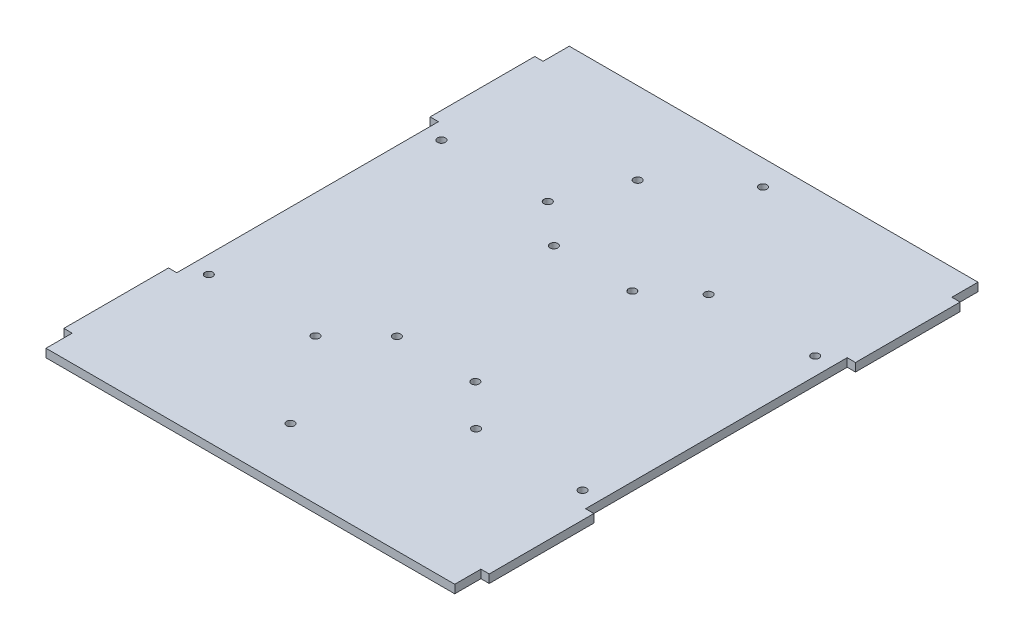
ISO-10303-21;
HEADER;
FILE_DESCRIPTION(('STEP AP214'),'2;1');
FILE_NAME('part.step','',(''),(''),'','','');
FILE_SCHEMA(('AUTOMOTIVE_DESIGN { 1 0 10303 214 1 1 1 1 }'));
ENDSEC;
DATA;
#1=APPLICATION_CONTEXT('core data for automotive mechanical design processes');
#2=APPLICATION_PROTOCOL_DEFINITION('international standard','automotive_design',2000,#1);
#3=PRODUCT_CONTEXT('',#1,'mechanical');
#4=PRODUCT('Part','Part','',(#3));
#5=PRODUCT_RELATED_PRODUCT_CATEGORY('part','',(#4));
#6=PRODUCT_DEFINITION_FORMATION('','',#4);
#7=PRODUCT_DEFINITION_CONTEXT('part definition',#1,'design');
#8=PRODUCT_DEFINITION('design','',#6,#7);
#9=PRODUCT_DEFINITION_SHAPE('','',#8);
#10=(LENGTH_UNIT() NAMED_UNIT(*) SI_UNIT(.MILLI.,.METRE.));
#11=(NAMED_UNIT(*) PLANE_ANGLE_UNIT() SI_UNIT($,.RADIAN.));
#12=(NAMED_UNIT(*) SI_UNIT($,.STERADIAN.) SOLID_ANGLE_UNIT());
#13=UNCERTAINTY_MEASURE_WITH_UNIT(LENGTH_MEASURE(1.E-05),#10,'distance_accuracy_value','');
#14=(GEOMETRIC_REPRESENTATION_CONTEXT(3) GLOBAL_UNCERTAINTY_ASSIGNED_CONTEXT((#13)) GLOBAL_UNIT_ASSIGNED_CONTEXT((#10,
#11,#12)) REPRESENTATION_CONTEXT('',''));
#15=CARTESIAN_POINT('',(0.,0.,0.));
#16=DIRECTION('',(0.,0.,1.));
#17=DIRECTION('',(1.,0.,0.));
#18=AXIS2_PLACEMENT_3D('',#15,#16,#17);
#19=CARTESIAN_POINT('',(0.,3.175,-10.));
#20=DIRECTION('',(1.,0.,0.));
#21=DIRECTION('',(0.,0.,-1.));
#22=AXIS2_PLACEMENT_3D('',#19,#20,#21);
#23=PLANE('',#22);
#24=DIRECTION('',(0.,0.,1.));
#25=VECTOR('',#24,1.);
#26=CARTESIAN_POINT('',(0.,0.,-10.));
#27=LINE('',#26,#25);
#28=CARTESIAN_POINT('',(0.,0.,-10.));
#29=VERTEX_POINT('',#28);
#30=CARTESIAN_POINT('',(0.,0.,0.));
#31=VERTEX_POINT('',#30);
#32=EDGE_CURVE('E201',#29,#31,#27,.T.);
#33=ORIENTED_EDGE('',*,*,#32,.T.);
#34=DIRECTION('',(0.,-1.,0.));
#35=VECTOR('',#34,1.);
#36=CARTESIAN_POINT('',(0.,3.175,0.));
#37=LINE('',#36,#35);
#38=CARTESIAN_POINT('',(0.,3.175,0.));
#39=VERTEX_POINT('',#38);
#40=EDGE_CURVE('E11',#39,#31,#37,.T.);
#41=ORIENTED_EDGE('',*,*,#40,.F.);
#42=DIRECTION('',(0.,0.,1.));
#43=VECTOR('',#42,1.);
#44=CARTESIAN_POINT('',(0.,3.175,-10.));
#45=LINE('',#44,#43);
#46=CARTESIAN_POINT('',(0.,3.175,-10.));
#47=VERTEX_POINT('',#46);
#48=EDGE_CURVE('E240',#47,#39,#45,.T.);
#49=ORIENTED_EDGE('',*,*,#48,.F.);
#50=DIRECTION('',(0.,-1.,0.));
#51=VECTOR('',#50,1.);
#52=CARTESIAN_POINT('',(0.,3.175,-10.));
#53=LINE('',#52,#51);
#54=EDGE_CURVE('E197',#47,#29,#53,.T.);
#55=ORIENTED_EDGE('',*,*,#54,.T.);
#56=EDGE_LOOP('',(#33,#41,#49,#55));
#57=FACE_BOUND('',#56,.T.);
#58=ADVANCED_FACE('F33',(#57),#23,.F.);
#59=CARTESIAN_POINT('',(0.,3.175,0.));
#60=DIRECTION('',(0.,0.,-1.));
#61=DIRECTION('',(-1.,0.,0.));
#62=AXIS2_PLACEMENT_3D('',#59,#60,#61);
#63=PLANE('',#62);
#64=DIRECTION('',(1.,0.,0.));
#65=VECTOR('',#64,1.);
#66=CARTESIAN_POINT('',(0.,0.,0.));
#67=LINE('',#66,#65);
#68=CARTESIAN_POINT('',(156.24,0.,0.));
#69=VERTEX_POINT('',#68);
#70=EDGE_CURVE('E204',#31,#69,#67,.T.);
#71=ORIENTED_EDGE('',*,*,#70,.T.);
#72=DIRECTION('',(0.,-1.,0.));
#73=VECTOR('',#72,1.);
#74=CARTESIAN_POINT('',(156.24,3.175,0.));
#75=LINE('',#74,#73);
#76=CARTESIAN_POINT('',(156.24,3.175,0.));
#77=VERTEX_POINT('',#76);
#78=EDGE_CURVE('E41',#77,#69,#75,.T.);
#79=ORIENTED_EDGE('',*,*,#78,.F.);
#80=DIRECTION('',(1.,0.,0.));
#81=VECTOR('',#80,1.);
#82=CARTESIAN_POINT('',(0.,3.175,0.));
#83=LINE('',#82,#81);
#84=EDGE_CURVE('E128',#39,#77,#83,.T.);
#85=ORIENTED_EDGE('',*,*,#84,.F.);
#86=ORIENTED_EDGE('',*,*,#40,.T.);
#87=EDGE_LOOP('',(#71,#79,#85,#86));
#88=FACE_BOUND('',#87,.T.);
#89=ADVANCED_FACE('F359',(#88),#63,.F.);
#90=CARTESIAN_POINT('',(156.24,3.175,-10.));
#91=DIRECTION('',(-1.,0.,0.));
#92=DIRECTION('',(0.,0.,1.));
#93=AXIS2_PLACEMENT_3D('',#90,#91,#92);
#94=PLANE('',#93);
#95=DIRECTION('',(0.,0.,-1.));
#96=VECTOR('',#95,1.);
#97=CARTESIAN_POINT('',(156.24,0.,-10.));
#98=LINE('',#97,#96);
#99=CARTESIAN_POINT('',(156.24,0.,-10.));
#100=VERTEX_POINT('',#99);
#101=EDGE_CURVE('E207',#69,#100,#98,.T.);
#102=ORIENTED_EDGE('',*,*,#101,.T.);
#103=DIRECTION('',(0.,-1.,0.));
#104=VECTOR('',#103,1.);
#105=CARTESIAN_POINT('',(156.24,3.175,-10.));
#106=LINE('',#105,#104);
#107=CARTESIAN_POINT('',(156.24,3.175,-10.));
#108=VERTEX_POINT('',#107);
#109=EDGE_CURVE('E283',#108,#100,#106,.T.);
#110=ORIENTED_EDGE('',*,*,#109,.F.);
#111=DIRECTION('',(0.,0.,-1.));
#112=VECTOR('',#111,1.);
#113=CARTESIAN_POINT('',(156.24,3.175,-10.));
#114=LINE('',#113,#112);
#115=EDGE_CURVE('E291',#77,#108,#114,.T.);
#116=ORIENTED_EDGE('',*,*,#115,.F.);
#117=ORIENTED_EDGE('',*,*,#78,.T.);
#118=EDGE_LOOP('',(#102,#110,#116,#117));
#119=FACE_BOUND('',#118,.T.);
#120=ADVANCED_FACE('F289',(#119),#94,.F.);
#121=CARTESIAN_POINT('',(156.24,3.175,-10.));
#122=DIRECTION('',(0.,0.,-1.));
#123=DIRECTION('',(-1.,0.,0.));
#124=AXIS2_PLACEMENT_3D('',#121,#122,#123);
#125=PLANE('',#124);
#126=DIRECTION('',(1.,0.,0.));
#127=VECTOR('',#126,1.);
#128=CARTESIAN_POINT('',(156.24,0.,-10.));
#129=LINE('',#128,#127);
#130=CARTESIAN_POINT('',(159.415,0.,-10.));
#131=VERTEX_POINT('',#130);
#132=EDGE_CURVE('E209',#100,#131,#129,.T.);
#133=ORIENTED_EDGE('',*,*,#132,.T.);
#134=DIRECTION('',(0.,-1.,0.));
#135=VECTOR('',#134,1.);
#136=CARTESIAN_POINT('',(159.415,3.175,-10.));
#137=LINE('',#136,#135);
#138=CARTESIAN_POINT('',(159.415,3.175,-10.));
#139=VERTEX_POINT('',#138);
#140=EDGE_CURVE('E280',#139,#131,#137,.T.);
#141=ORIENTED_EDGE('',*,*,#140,.F.);
#142=DIRECTION('',(1.,0.,0.));
#143=VECTOR('',#142,1.);
#144=CARTESIAN_POINT('',(156.24,3.175,-10.));
#145=LINE('',#144,#143);
#146=EDGE_CURVE('E309',#108,#139,#145,.T.);
#147=ORIENTED_EDGE('',*,*,#146,.F.);
#148=ORIENTED_EDGE('',*,*,#109,.T.);
#149=EDGE_LOOP('',(#133,#141,#147,#148));
#150=FACE_BOUND('',#149,.T.);
#151=ADVANCED_FACE('F300',(#150),#125,.F.);
#152=CARTESIAN_POINT('',(159.415,3.175,-10.));
#153=DIRECTION('',(-1.,0.,0.));
#154=DIRECTION('',(0.,0.,1.));
#155=AXIS2_PLACEMENT_3D('',#152,#153,#154);
#156=PLANE('',#155);
#157=DIRECTION('',(0.,0.,-1.));
#158=VECTOR('',#157,1.);
#159=CARTESIAN_POINT('',(159.415,0.,-10.));
#160=LINE('',#159,#158);
#161=CARTESIAN_POINT('',(159.415,0.,-50.));
#162=VERTEX_POINT('',#161);
#163=EDGE_CURVE('E211',#131,#162,#160,.T.);
#164=ORIENTED_EDGE('',*,*,#163,.T.);
#165=DIRECTION('',(0.,-1.,0.));
#166=VECTOR('',#165,1.);
#167=CARTESIAN_POINT('',(159.415,3.175,-50.));
#168=LINE('',#167,#166);
#169=CARTESIAN_POINT('',(159.415,3.175,-50.));
#170=VERTEX_POINT('',#169);
#171=EDGE_CURVE('E277',#170,#162,#168,.T.);
#172=ORIENTED_EDGE('',*,*,#171,.F.);
#173=DIRECTION('',(0.,0.,-1.));
#174=VECTOR('',#173,1.);
#175=CARTESIAN_POINT('',(159.415,3.175,-10.));
#176=LINE('',#175,#174);
#177=EDGE_CURVE('E306',#139,#170,#176,.T.);
#178=ORIENTED_EDGE('',*,*,#177,.F.);
#179=ORIENTED_EDGE('',*,*,#140,.T.);
#180=EDGE_LOOP('',(#164,#172,#178,#179));
#181=FACE_BOUND('',#180,.T.);
#182=ADVANCED_FACE('F304',(#181),#156,.F.);
#183=CARTESIAN_POINT('',(159.415,3.175,-50.));
#184=DIRECTION('',(0.,0.,1.));
#185=DIRECTION('',(1.,0.,0.));
#186=AXIS2_PLACEMENT_3D('',#183,#184,#185);
#187=PLANE('',#186);
#188=DIRECTION('',(-1.,0.,0.));
#189=VECTOR('',#188,1.);
#190=CARTESIAN_POINT('',(159.415,0.,-50.));
#191=LINE('',#190,#189);
#192=CARTESIAN_POINT('',(156.24,0.,-50.));
#193=VERTEX_POINT('',#192);
#194=EDGE_CURVE('E213',#162,#193,#191,.T.);
#195=ORIENTED_EDGE('',*,*,#194,.T.);
#196=DIRECTION('',(0.,-1.,0.));
#197=VECTOR('',#196,1.);
#198=CARTESIAN_POINT('',(156.24,3.175,-50.));
#199=LINE('',#198,#197);
#200=CARTESIAN_POINT('',(156.24,3.175,-50.));
#201=VERTEX_POINT('',#200);
#202=EDGE_CURVE('E274',#201,#193,#199,.T.);
#203=ORIENTED_EDGE('',*,*,#202,.F.);
#204=DIRECTION('',(-1.,0.,0.));
#205=VECTOR('',#204,1.);
#206=CARTESIAN_POINT('',(159.415,3.175,-50.));
#207=LINE('',#206,#205);
#208=EDGE_CURVE('E308',#170,#201,#207,.T.);
#209=ORIENTED_EDGE('',*,*,#208,.F.);
#210=ORIENTED_EDGE('',*,*,#171,.T.);
#211=EDGE_LOOP('',(#195,#203,#209,#210));
#212=FACE_BOUND('',#211,.T.);
#213=ADVANCED_FACE('F372',(#212),#187,.F.);
#214=CARTESIAN_POINT('',(156.24,3.175,-150.));
#215=DIRECTION('',(-1.,0.,0.));
#216=DIRECTION('',(0.,0.,1.));
#217=AXIS2_PLACEMENT_3D('',#214,#215,#216);
#218=PLANE('',#217);
#219=DIRECTION('',(0.,0.,-1.));
#220=VECTOR('',#219,1.);
#221=CARTESIAN_POINT('',(156.24,0.,-150.));
#222=LINE('',#221,#220);
#223=CARTESIAN_POINT('',(156.24,0.,-150.));
#224=VERTEX_POINT('',#223);
#225=EDGE_CURVE('E215',#193,#224,#222,.T.);
#226=ORIENTED_EDGE('',*,*,#225,.T.);
#227=DIRECTION('',(0.,-1.,0.));
#228=VECTOR('',#227,1.);
#229=CARTESIAN_POINT('',(156.24,3.175,-150.));
#230=LINE('',#229,#228);
#231=CARTESIAN_POINT('',(156.24,3.175,-150.));
#232=VERTEX_POINT('',#231);
#233=EDGE_CURVE('E271',#232,#224,#230,.T.);
#234=ORIENTED_EDGE('',*,*,#233,.F.);
#235=DIRECTION('',(0.,0.,-1.));
#236=VECTOR('',#235,1.);
#237=CARTESIAN_POINT('',(156.24,3.175,-150.));
#238=LINE('',#237,#236);
#239=EDGE_CURVE('E311',#201,#232,#238,.T.);
#240=ORIENTED_EDGE('',*,*,#239,.F.);
#241=ORIENTED_EDGE('',*,*,#202,.T.);
#242=EDGE_LOOP('',(#226,#234,#240,#241));
#243=FACE_BOUND('',#242,.T.);
#244=ADVANCED_FACE('F375',(#243),#218,.F.);
#245=CARTESIAN_POINT('',(159.415,3.175,-150.));
#246=DIRECTION('',(0.,0.,-1.));
#247=DIRECTION('',(-1.,0.,0.));
#248=AXIS2_PLACEMENT_3D('',#245,#246,#247);
#249=PLANE('',#248);
#250=DIRECTION('',(1.,0.,0.));
#251=VECTOR('',#250,1.);
#252=CARTESIAN_POINT('',(159.415,0.,-150.));
#253=LINE('',#252,#251);
#254=CARTESIAN_POINT('',(159.415,0.,-150.));
#255=VERTEX_POINT('',#254);
#256=EDGE_CURVE('E217',#224,#255,#253,.T.);
#257=ORIENTED_EDGE('',*,*,#256,.T.);
#258=DIRECTION('',(0.,-1.,0.));
#259=VECTOR('',#258,1.);
#260=CARTESIAN_POINT('',(159.415,3.175,-150.));
#261=LINE('',#260,#259);
#262=CARTESIAN_POINT('',(159.415,3.175,-150.));
#263=VERTEX_POINT('',#262);
#264=EDGE_CURVE('E268',#263,#255,#261,.T.);
#265=ORIENTED_EDGE('',*,*,#264,.F.);
#266=DIRECTION('',(1.,0.,0.));
#267=VECTOR('',#266,1.);
#268=CARTESIAN_POINT('',(159.415,3.175,-150.));
#269=LINE('',#268,#267);
#270=EDGE_CURVE('E317',#232,#263,#269,.T.);
#271=ORIENTED_EDGE('',*,*,#270,.F.);
#272=ORIENTED_EDGE('',*,*,#233,.T.);
#273=EDGE_LOOP('',(#257,#265,#271,#272));
#274=FACE_BOUND('',#273,.T.);
#275=ADVANCED_FACE('F379',(#274),#249,.F.);
#276=CARTESIAN_POINT('',(159.415,3.175,-190.));
#277=DIRECTION('',(-1.,0.,0.));
#278=DIRECTION('',(0.,0.,1.));
#279=AXIS2_PLACEMENT_3D('',#276,#277,#278);
#280=PLANE('',#279);
#281=DIRECTION('',(0.,0.,-1.));
#282=VECTOR('',#281,1.);
#283=CARTESIAN_POINT('',(159.415,0.,-190.));
#284=LINE('',#283,#282);
#285=CARTESIAN_POINT('',(159.415,0.,-190.));
#286=VERTEX_POINT('',#285);
#287=EDGE_CURVE('E219',#255,#286,#284,.T.);
#288=ORIENTED_EDGE('',*,*,#287,.T.);
#289=DIRECTION('',(0.,-1.,0.));
#290=VECTOR('',#289,1.);
#291=CARTESIAN_POINT('',(159.415,3.175,-190.));
#292=LINE('',#291,#290);
#293=CARTESIAN_POINT('',(159.415,3.175,-190.));
#294=VERTEX_POINT('',#293);
#295=EDGE_CURVE('E265',#294,#286,#292,.T.);
#296=ORIENTED_EDGE('',*,*,#295,.F.);
#297=DIRECTION('',(0.,0.,-1.));
#298=VECTOR('',#297,1.);
#299=CARTESIAN_POINT('',(159.415,3.175,-190.));
#300=LINE('',#299,#298);
#301=EDGE_CURVE('E319',#263,#294,#300,.T.);
#302=ORIENTED_EDGE('',*,*,#301,.F.);
#303=ORIENTED_EDGE('',*,*,#264,.T.);
#304=EDGE_LOOP('',(#288,#296,#302,#303));
#305=FACE_BOUND('',#304,.T.);
#306=ADVANCED_FACE('F383',(#305),#280,.F.);
#307=CARTESIAN_POINT('',(156.24,3.175,-190.));
#308=DIRECTION('',(0.,0.,1.));
#309=DIRECTION('',(1.,0.,0.));
#310=AXIS2_PLACEMENT_3D('',#307,#308,#309);
#311=PLANE('',#310);
#312=DIRECTION('',(-1.,0.,0.));
#313=VECTOR('',#312,1.);
#314=CARTESIAN_POINT('',(156.24,0.,-190.));
#315=LINE('',#314,#313);
#316=CARTESIAN_POINT('',(156.24,0.,-190.));
#317=VERTEX_POINT('',#316);
#318=EDGE_CURVE('E221',#286,#317,#315,.T.);
#319=ORIENTED_EDGE('',*,*,#318,.T.);
#320=DIRECTION('',(0.,-1.,0.));
#321=VECTOR('',#320,1.);
#322=CARTESIAN_POINT('',(156.24,3.175,-190.));
#323=LINE('',#322,#321);
#324=CARTESIAN_POINT('',(156.24,3.175,-190.));
#325=VERTEX_POINT('',#324);
#326=EDGE_CURVE('E262',#325,#317,#323,.T.);
#327=ORIENTED_EDGE('',*,*,#326,.F.);
#328=DIRECTION('',(-1.,0.,0.));
#329=VECTOR('',#328,1.);
#330=CARTESIAN_POINT('',(156.24,3.175,-190.));
#331=LINE('',#330,#329);
#332=EDGE_CURVE('E321',#294,#325,#331,.T.);
#333=ORIENTED_EDGE('',*,*,#332,.F.);
#334=ORIENTED_EDGE('',*,*,#295,.T.);
#335=EDGE_LOOP('',(#319,#327,#333,#334));
#336=FACE_BOUND('',#335,.T.);
#337=ADVANCED_FACE('F387',(#336),#311,.F.);
#338=CARTESIAN_POINT('',(156.24,3.175,-200.));
#339=DIRECTION('',(-1.,0.,0.));
#340=DIRECTION('',(0.,0.,1.));
#341=AXIS2_PLACEMENT_3D('',#338,#339,#340);
#342=PLANE('',#341);
#343=DIRECTION('',(0.,0.,-1.));
#344=VECTOR('',#343,1.);
#345=CARTESIAN_POINT('',(156.24,0.,-200.));
#346=LINE('',#345,#344);
#347=CARTESIAN_POINT('',(156.24,0.,-200.));
#348=VERTEX_POINT('',#347);
#349=EDGE_CURVE('E223',#317,#348,#346,.T.);
#350=ORIENTED_EDGE('',*,*,#349,.T.);
#351=DIRECTION('',(0.,-1.,0.));
#352=VECTOR('',#351,1.);
#353=CARTESIAN_POINT('',(156.24,3.175,-200.));
#354=LINE('',#353,#352);
#355=CARTESIAN_POINT('',(156.24,3.175,-200.));
#356=VERTEX_POINT('',#355);
#357=EDGE_CURVE('E259',#356,#348,#354,.T.);
#358=ORIENTED_EDGE('',*,*,#357,.F.);
#359=DIRECTION('',(0.,0.,-1.));
#360=VECTOR('',#359,1.);
#361=CARTESIAN_POINT('',(156.24,3.175,-200.));
#362=LINE('',#361,#360);
#363=EDGE_CURVE('E323',#325,#356,#362,.T.);
#364=ORIENTED_EDGE('',*,*,#363,.F.);
#365=ORIENTED_EDGE('',*,*,#326,.T.);
#366=EDGE_LOOP('',(#350,#358,#364,#365));
#367=FACE_BOUND('',#366,.T.);
#368=ADVANCED_FACE('F391',(#367),#342,.F.);
#369=CARTESIAN_POINT('',(0.,3.175,-200.));
#370=DIRECTION('',(0.,0.,1.));
#371=DIRECTION('',(1.,0.,0.));
#372=AXIS2_PLACEMENT_3D('',#369,#370,#371);
#373=PLANE('',#372);
#374=DIRECTION('',(-1.,0.,0.));
#375=VECTOR('',#374,1.);
#376=CARTESIAN_POINT('',(0.,0.,-200.));
#377=LINE('',#376,#375);
#378=CARTESIAN_POINT('',(0.,0.,-200.));
#379=VERTEX_POINT('',#378);
#380=EDGE_CURVE('E225',#348,#379,#377,.T.);
#381=ORIENTED_EDGE('',*,*,#380,.T.);
#382=DIRECTION('',(0.,-1.,0.));
#383=VECTOR('',#382,1.);
#384=CARTESIAN_POINT('',(0.,3.175,-200.));
#385=LINE('',#384,#383);
#386=CARTESIAN_POINT('',(0.,3.175,-200.));
#387=VERTEX_POINT('',#386);
#388=EDGE_CURVE('E256',#387,#379,#385,.T.);
#389=ORIENTED_EDGE('',*,*,#388,.F.);
#390=DIRECTION('',(-1.,0.,0.));
#391=VECTOR('',#390,1.);
#392=CARTESIAN_POINT('',(0.,3.175,-200.));
#393=LINE('',#392,#391);
#394=EDGE_CURVE('E325',#356,#387,#393,.T.);
#395=ORIENTED_EDGE('',*,*,#394,.F.);
#396=ORIENTED_EDGE('',*,*,#357,.T.);
#397=EDGE_LOOP('',(#381,#389,#395,#396));
#398=FACE_BOUND('',#397,.T.);
#399=ADVANCED_FACE('F395',(#398),#373,.F.);
#400=CARTESIAN_POINT('',(0.,3.175,-200.));
#401=DIRECTION('',(1.,0.,0.));
#402=DIRECTION('',(0.,0.,-1.));
#403=AXIS2_PLACEMENT_3D('',#400,#401,#402);
#404=PLANE('',#403);
#405=DIRECTION('',(0.,0.,1.));
#406=VECTOR('',#405,1.);
#407=CARTESIAN_POINT('',(0.,0.,-200.));
#408=LINE('',#407,#406);
#409=CARTESIAN_POINT('',(0.,0.,-190.));
#410=VERTEX_POINT('',#409);
#411=EDGE_CURVE('E227',#379,#410,#408,.T.);
#412=ORIENTED_EDGE('',*,*,#411,.T.);
#413=DIRECTION('',(0.,-1.,0.));
#414=VECTOR('',#413,1.);
#415=CARTESIAN_POINT('',(0.,3.175,-190.));
#416=LINE('',#415,#414);
#417=CARTESIAN_POINT('',(0.,3.175,-190.));
#418=VERTEX_POINT('',#417);
#419=EDGE_CURVE('E253',#418,#410,#416,.T.);
#420=ORIENTED_EDGE('',*,*,#419,.F.);
#421=DIRECTION('',(0.,0.,1.));
#422=VECTOR('',#421,1.);
#423=CARTESIAN_POINT('',(0.,3.175,-200.));
#424=LINE('',#423,#422);
#425=EDGE_CURVE('E327',#387,#418,#424,.T.);
#426=ORIENTED_EDGE('',*,*,#425,.F.);
#427=ORIENTED_EDGE('',*,*,#388,.T.);
#428=EDGE_LOOP('',(#412,#420,#426,#427));
#429=FACE_BOUND('',#428,.T.);
#430=ADVANCED_FACE('F399',(#429),#404,.F.);
#431=CARTESIAN_POINT('',(0.,3.175,-190.));
#432=DIRECTION('',(0.,0.,1.));
#433=DIRECTION('',(1.,0.,0.));
#434=AXIS2_PLACEMENT_3D('',#431,#432,#433);
#435=PLANE('',#434);
#436=DIRECTION('',(-1.,0.,0.));
#437=VECTOR('',#436,1.);
#438=CARTESIAN_POINT('',(0.,0.,-190.));
#439=LINE('',#438,#437);
#440=CARTESIAN_POINT('',(-3.175,0.,-190.));
#441=VERTEX_POINT('',#440);
#442=EDGE_CURVE('E229',#410,#441,#439,.T.);
#443=ORIENTED_EDGE('',*,*,#442,.T.);
#444=DIRECTION('',(0.,-1.,0.));
#445=VECTOR('',#444,1.);
#446=CARTESIAN_POINT('',(-3.175,3.175,-190.));
#447=LINE('',#446,#445);
#448=CARTESIAN_POINT('',(-3.175,3.175,-190.));
#449=VERTEX_POINT('',#448);
#450=EDGE_CURVE('E250',#449,#441,#447,.T.);
#451=ORIENTED_EDGE('',*,*,#450,.F.);
#452=DIRECTION('',(-1.,0.,0.));
#453=VECTOR('',#452,1.);
#454=CARTESIAN_POINT('',(0.,3.175,-190.));
#455=LINE('',#454,#453);
#456=EDGE_CURVE('E329',#418,#449,#455,.T.);
#457=ORIENTED_EDGE('',*,*,#456,.F.);
#458=ORIENTED_EDGE('',*,*,#419,.T.);
#459=EDGE_LOOP('',(#443,#451,#457,#458));
#460=FACE_BOUND('',#459,.T.);
#461=ADVANCED_FACE('F403',(#460),#435,.F.);
#462=CARTESIAN_POINT('',(-3.175,3.175,-190.));
#463=DIRECTION('',(1.,0.,0.));
#464=DIRECTION('',(0.,0.,-1.));
#465=AXIS2_PLACEMENT_3D('',#462,#463,#464);
#466=PLANE('',#465);
#467=DIRECTION('',(0.,0.,1.));
#468=VECTOR('',#467,1.);
#469=CARTESIAN_POINT('',(-3.175,0.,-190.));
#470=LINE('',#469,#468);
#471=CARTESIAN_POINT('',(-3.17499999999999,0.,-150.));
#472=VERTEX_POINT('',#471);
#473=EDGE_CURVE('E231',#441,#472,#470,.T.);
#474=ORIENTED_EDGE('',*,*,#473,.T.);
#475=DIRECTION('',(0.,-1.,0.));
#476=VECTOR('',#475,1.);
#477=CARTESIAN_POINT('',(-3.17499999999999,3.175,-150.));
#478=LINE('',#477,#476);
#479=CARTESIAN_POINT('',(-3.17499999999999,3.175,-150.));
#480=VERTEX_POINT('',#479);
#481=EDGE_CURVE('E247',#480,#472,#478,.T.);
#482=ORIENTED_EDGE('',*,*,#481,.F.);
#483=DIRECTION('',(0.,0.,1.));
#484=VECTOR('',#483,1.);
#485=CARTESIAN_POINT('',(-3.175,3.175,-190.));
#486=LINE('',#485,#484);
#487=EDGE_CURVE('E331',#449,#480,#486,.T.);
#488=ORIENTED_EDGE('',*,*,#487,.F.);
#489=ORIENTED_EDGE('',*,*,#450,.T.);
#490=EDGE_LOOP('',(#474,#482,#488,#489));
#491=FACE_BOUND('',#490,.T.);
#492=ADVANCED_FACE('F407',(#491),#466,.F.);
#493=CARTESIAN_POINT('',(-3.17499999999999,3.175,-150.));
#494=DIRECTION('',(0.,0.,-1.));
#495=DIRECTION('',(-1.,0.,0.));
#496=AXIS2_PLACEMENT_3D('',#493,#494,#495);
#497=PLANE('',#496);
#498=DIRECTION('',(1.,0.,0.));
#499=VECTOR('',#498,1.);
#500=CARTESIAN_POINT('',(-3.17499999999999,0.,-150.));
#501=LINE('',#500,#499);
#502=CARTESIAN_POINT('',(0.,0.,-150.));
#503=VERTEX_POINT('',#502);
#504=EDGE_CURVE('E233',#472,#503,#501,.T.);
#505=ORIENTED_EDGE('',*,*,#504,.T.);
#506=DIRECTION('',(0.,-1.,0.));
#507=VECTOR('',#506,1.);
#508=CARTESIAN_POINT('',(0.,3.175,-150.));
#509=LINE('',#508,#507);
#510=CARTESIAN_POINT('',(0.,3.175,-150.));
#511=VERTEX_POINT('',#510);
#512=EDGE_CURVE('E244',#511,#503,#509,.T.);
#513=ORIENTED_EDGE('',*,*,#512,.F.);
#514=DIRECTION('',(1.,0.,0.));
#515=VECTOR('',#514,1.);
#516=CARTESIAN_POINT('',(-3.17499999999999,3.175,-150.));
#517=LINE('',#516,#515);
#518=EDGE_CURVE('E333',#480,#511,#517,.T.);
#519=ORIENTED_EDGE('',*,*,#518,.F.);
#520=ORIENTED_EDGE('',*,*,#481,.T.);
#521=EDGE_LOOP('',(#505,#513,#519,#520));
#522=FACE_BOUND('',#521,.T.);
#523=ADVANCED_FACE('F339',(#522),#497,.F.);
#524=CARTESIAN_POINT('',(0.,3.175,-150.));
#525=DIRECTION('',(1.,0.,0.));
#526=DIRECTION('',(0.,0.,-1.));
#527=AXIS2_PLACEMENT_3D('',#524,#525,#526);
#528=PLANE('',#527);
#529=DIRECTION('',(0.,0.,1.));
#530=VECTOR('',#529,1.);
#531=CARTESIAN_POINT('',(0.,0.,-150.));
#532=LINE('',#531,#530);
#533=CARTESIAN_POINT('',(0.,0.,-50.));
#534=VERTEX_POINT('',#533);
#535=EDGE_CURVE('E235',#503,#534,#532,.T.);
#536=ORIENTED_EDGE('',*,*,#535,.T.);
#537=DIRECTION('',(0.,-1.,0.));
#538=VECTOR('',#537,1.);
#539=CARTESIAN_POINT('',(0.,3.175,-50.));
#540=LINE('',#539,#538);
#541=CARTESIAN_POINT('',(0.,3.175,-50.));
#542=VERTEX_POINT('',#541);
#543=EDGE_CURVE('E192',#542,#534,#540,.T.);
#544=ORIENTED_EDGE('',*,*,#543,.F.);
#545=DIRECTION('',(0.,0.,1.));
#546=VECTOR('',#545,1.);
#547=CARTESIAN_POINT('',(0.,3.175,-150.));
#548=LINE('',#547,#546);
#549=EDGE_CURVE('E183',#511,#542,#548,.T.);
#550=ORIENTED_EDGE('',*,*,#549,.F.);
#551=ORIENTED_EDGE('',*,*,#512,.T.);
#552=EDGE_LOOP('',(#536,#544,#550,#551));
#553=FACE_BOUND('',#552,.T.);
#554=ADVANCED_FACE('F343',(#553),#528,.F.);
#555=CARTESIAN_POINT('',(-3.17499999999998,3.175,-50.));
#556=DIRECTION('',(0.,0.,1.));
#557=DIRECTION('',(1.,0.,0.));
#558=AXIS2_PLACEMENT_3D('',#555,#556,#557);
#559=PLANE('',#558);
#560=DIRECTION('',(-1.,0.,0.));
#561=VECTOR('',#560,1.);
#562=CARTESIAN_POINT('',(-3.17499999999998,0.,-50.));
#563=LINE('',#562,#561);
#564=CARTESIAN_POINT('',(-3.17499999999998,0.,-50.));
#565=VERTEX_POINT('',#564);
#566=EDGE_CURVE('E191',#534,#565,#563,.T.);
#567=ORIENTED_EDGE('',*,*,#566,.T.);
#568=DIRECTION('',(0.,-1.,0.));
#569=VECTOR('',#568,1.);
#570=CARTESIAN_POINT('',(-3.17499999999998,3.175,-50.));
#571=LINE('',#570,#569);
#572=CARTESIAN_POINT('',(-3.17499999999998,3.175,-50.));
#573=VERTEX_POINT('',#572);
#574=EDGE_CURVE('E188',#573,#565,#571,.T.);
#575=ORIENTED_EDGE('',*,*,#574,.F.);
#576=DIRECTION('',(-1.,0.,0.));
#577=VECTOR('',#576,1.);
#578=CARTESIAN_POINT('',(-3.17499999999998,3.175,-50.));
#579=LINE('',#578,#577);
#580=EDGE_CURVE('E177',#542,#573,#579,.T.);
#581=ORIENTED_EDGE('',*,*,#580,.F.);
#582=ORIENTED_EDGE('',*,*,#543,.T.);
#583=EDGE_LOOP('',(#567,#575,#581,#582));
#584=FACE_BOUND('',#583,.T.);
#585=ADVANCED_FACE('F189',(#584),#559,.F.);
#586=CARTESIAN_POINT('',(-3.17499999999998,3.175,-10.));
#587=DIRECTION('',(1.,0.,0.));
#588=DIRECTION('',(0.,0.,-1.));
#589=AXIS2_PLACEMENT_3D('',#586,#587,#588);
#590=PLANE('',#589);
#591=DIRECTION('',(0.,0.,1.));
#592=VECTOR('',#591,1.);
#593=CARTESIAN_POINT('',(-3.17499999999998,0.,-10.));
#594=LINE('',#593,#592);
#595=CARTESIAN_POINT('',(-3.17499999999998,0.,-10.));
#596=VERTEX_POINT('',#595);
#597=EDGE_CURVE('E114',#565,#596,#594,.T.);
#598=ORIENTED_EDGE('',*,*,#597,.T.);
#599=DIRECTION('',(0.,-1.,0.));
#600=VECTOR('',#599,1.);
#601=CARTESIAN_POINT('',(-3.17499999999998,3.175,-10.));
#602=LINE('',#601,#600);
#603=CARTESIAN_POINT('',(-3.17499999999998,3.175,-10.));
#604=VERTEX_POINT('',#603);
#605=EDGE_CURVE('E193',#604,#596,#602,.T.);
#606=ORIENTED_EDGE('',*,*,#605,.F.);
#607=DIRECTION('',(0.,0.,1.));
#608=VECTOR('',#607,1.);
#609=CARTESIAN_POINT('',(-3.17499999999998,3.175,-10.));
#610=LINE('',#609,#608);
#611=EDGE_CURVE('E181',#573,#604,#610,.T.);
#612=ORIENTED_EDGE('',*,*,#611,.F.);
#613=ORIENTED_EDGE('',*,*,#574,.T.);
#614=EDGE_LOOP('',(#598,#606,#612,#613));
#615=FACE_BOUND('',#614,.T.);
#616=ADVANCED_FACE('F195',(#615),#590,.F.);
#617=CARTESIAN_POINT('',(0.,3.175,-10.));
#618=DIRECTION('',(0.,0.,-1.));
#619=DIRECTION('',(-1.,0.,0.));
#620=AXIS2_PLACEMENT_3D('',#617,#618,#619);
#621=PLANE('',#620);
#622=DIRECTION('',(1.,0.,0.));
#623=VECTOR('',#622,1.);
#624=CARTESIAN_POINT('',(0.,0.,-10.));
#625=LINE('',#624,#623);
#626=EDGE_CURVE('E120',#596,#29,#625,.T.);
#627=ORIENTED_EDGE('',*,*,#626,.T.);
#628=ORIENTED_EDGE('',*,*,#54,.F.);
#629=DIRECTION('',(1.,0.,0.));
#630=VECTOR('',#629,1.);
#631=CARTESIAN_POINT('',(0.,3.175,-10.));
#632=LINE('',#631,#630);
#633=EDGE_CURVE('E49',#604,#47,#632,.T.);
#634=ORIENTED_EDGE('',*,*,#633,.F.);
#635=ORIENTED_EDGE('',*,*,#605,.T.);
#636=EDGE_LOOP('',(#627,#628,#634,#635));
#637=FACE_BOUND('',#636,.T.);
#638=ADVANCED_FACE('F347',(#637),#621,.F.);
#639=CARTESIAN_POINT('',(0.,3.175,0.));
#640=DIRECTION('',(0.,1.,0.));
#641=DIRECTION('',(0.,0.,1.));
#642=AXIS2_PLACEMENT_3D('',#639,#640,#641);
#643=PLANE('',#642);
#644=CARTESIAN_POINT('',(63.1212826767359,3.175,-131.000354826206));
#645=DIRECTION('',(0.,1.,0.));
#646=DIRECTION('',(0.,0.,1.));
#647=AXIS2_PLACEMENT_3D('',#644,#645,#646);
#648=CIRCLE('',#647,1.5);
#649=CARTESIAN_POINT('',(63.1212826767359,3.175,-129.500354826206));
#650=VERTEX_POINT('',#649);
#651=EDGE_CURVE('E603',#650,#650,#648,.T.);
#652=ORIENTED_EDGE('',*,*,#651,.F.);
#653=EDGE_LOOP('',(#652));
#654=FACE_BOUND('',#653,.T.);
#655=CARTESIAN_POINT('',(93.1199955436453,3.175,-130.999996355193));
#656=DIRECTION('',(0.,1.,0.));
#657=DIRECTION('',(0.,0.,1.));
#658=AXIS2_PLACEMENT_3D('',#655,#656,#657);
#659=CIRCLE('',#658,1.5);
#660=CARTESIAN_POINT('',(93.1199955436453,3.175,-129.499996355193));
#661=VERTEX_POINT('',#660);
#662=EDGE_CURVE('E605',#661,#661,#659,.T.);
#663=ORIENTED_EDGE('',*,*,#662,.F.);
#664=EDGE_LOOP('',(#663));
#665=FACE_BOUND('',#664,.T.);
#666=CARTESIAN_POINT('',(63.1212826767359,3.175,-71.0003548262055));
#667=DIRECTION('',(0.,1.,0.));
#668=DIRECTION('',(0.,0.,1.));
#669=AXIS2_PLACEMENT_3D('',#666,#667,#668);
#670=CIRCLE('',#669,1.5);
#671=CARTESIAN_POINT('',(63.1212826767359,3.175,-69.5003548262055));
#672=VERTEX_POINT('',#671);
#673=EDGE_CURVE('E613',#672,#672,#670,.T.);
#674=ORIENTED_EDGE('',*,*,#673,.F.);
#675=EDGE_LOOP('',(#674));
#676=FACE_BOUND('',#675,.T.);
#677=CARTESIAN_POINT('',(93.1199955436453,3.175,-70.9999963551928));
#678=DIRECTION('',(0.,1.,0.));
#679=DIRECTION('',(0.,0.,1.));
#680=AXIS2_PLACEMENT_3D('',#677,#678,#679);
#681=CIRCLE('',#680,1.5);
#682=CARTESIAN_POINT('',(93.1199955436453,3.175,-69.4999963551928));
#683=VERTEX_POINT('',#682);
#684=EDGE_CURVE('E619',#683,#683,#681,.T.);
#685=ORIENTED_EDGE('',*,*,#684,.F.);
#686=EDGE_LOOP('',(#685));
#687=FACE_BOUND('',#686,.T.);
#688=CARTESIAN_POINT('',(47.3275480638758,3.175,-144.467472704922));
#689=DIRECTION('',(0.,1.,0.));
#690=DIRECTION('',(0.,0.,1.));
#691=AXIS2_PLACEMENT_3D('',#688,#689,#690);
#692=CIRCLE('',#691,1.49999999999999);
#693=CARTESIAN_POINT('',(47.3275480638758,3.175,-142.967472704922));
#694=VERTEX_POINT('',#693);
#695=EDGE_CURVE('E625',#694,#694,#692,.T.);
#696=ORIENTED_EDGE('',*,*,#695,.F.);
#697=EDGE_LOOP('',(#696));
#698=FACE_BOUND('',#697,.T.);
#699=CARTESIAN_POINT('',(6.68210279946632,3.175,-144.467472704922));
#700=DIRECTION('',(0.,1.,0.));
#701=DIRECTION('',(0.,0.,1.));
#702=AXIS2_PLACEMENT_3D('',#699,#700,#701);
#703=CIRCLE('',#702,1.5);
#704=CARTESIAN_POINT('',(6.68210279946632,3.175,-142.967472704922));
#705=VERTEX_POINT('',#704);
#706=EDGE_CURVE('E631',#705,#705,#703,.T.);
#707=ORIENTED_EDGE('',*,*,#706,.F.);
#708=EDGE_LOOP('',(#707));
#709=FACE_BOUND('',#708,.T.);
#710=CARTESIAN_POINT('',(57.4269534270161,3.175,-168.726839726124));
#711=DIRECTION('',(0.,1.,0.));
#712=DIRECTION('',(0.,0.,1.));
#713=AXIS2_PLACEMENT_3D('',#710,#711,#712);
#714=CIRCLE('',#713,1.49999999999999);
#715=CARTESIAN_POINT('',(57.4269534270161,3.175,-167.226839726124));
#716=VERTEX_POINT('',#715);
#717=EDGE_CURVE('E637',#716,#716,#714,.T.);
#718=ORIENTED_EDGE('',*,*,#717,.F.);
#719=EDGE_LOOP('',(#718));
#720=FACE_BOUND('',#719,.T.);
#721=CARTESIAN_POINT('',(83.6295994976921,3.175,-190.400856445783));
#722=DIRECTION('',(0.,1.,0.));
#723=DIRECTION('',(0.,0.,1.));
#724=AXIS2_PLACEMENT_3D('',#721,#722,#723);
#725=CIRCLE('',#724,1.5);
#726=CARTESIAN_POINT('',(83.6295994976921,3.175,-188.900856445783));
#727=VERTEX_POINT('',#726);
#728=EDGE_CURVE('E643',#727,#727,#725,.T.);
#729=ORIENTED_EDGE('',*,*,#728,.F.);
#730=EDGE_LOOP('',(#729));
#731=FACE_BOUND('',#730,.T.);
#732=CARTESIAN_POINT('',(108.822249067763,3.175,-144.454220349339));
#733=DIRECTION('',(0.,1.,0.));
#734=DIRECTION('',(0.,0.,1.));
#735=AXIS2_PLACEMENT_3D('',#732,#733,#734);
#736=CIRCLE('',#735,1.5);
#737=CARTESIAN_POINT('',(108.822249067763,3.175,-142.954220349339));
#738=VERTEX_POINT('',#737);
#739=EDGE_CURVE('E649',#738,#738,#736,.T.);
#740=ORIENTED_EDGE('',*,*,#739,.F.);
#741=EDGE_LOOP('',(#740));
#742=FACE_BOUND('',#741,.T.);
#743=CARTESIAN_POINT('',(149.551998107119,3.175,-144.454220349339));
#744=DIRECTION('',(0.,1.,0.));
#745=DIRECTION('',(0.,0.,1.));
#746=AXIS2_PLACEMENT_3D('',#743,#744,#745);
#747=CIRCLE('',#746,1.5);
#748=CARTESIAN_POINT('',(149.551998107119,3.175,-142.954220349339));
#749=VERTEX_POINT('',#748);
#750=EDGE_CURVE('E655',#749,#749,#747,.T.);
#751=ORIENTED_EDGE('',*,*,#750,.F.);
#752=EDGE_LOOP('',(#751));
#753=FACE_BOUND('',#752,.T.);
#754=CARTESIAN_POINT('',(47.417498943027,3.175,-55.5449961801235));
#755=DIRECTION('',(0.,1.,0.));
#756=DIRECTION('',(0.,0.,1.));
#757=AXIS2_PLACEMENT_3D('',#754,#755,#756);
#758=CIRCLE('',#757,1.49999999999999);
#759=CARTESIAN_POINT('',(47.417498943027,3.175,-54.0449961801235));
#760=VERTEX_POINT('',#759);
#761=EDGE_CURVE('E661',#760,#760,#758,.T.);
#762=ORIENTED_EDGE('',*,*,#761,.F.);
#763=EDGE_LOOP('',(#762));
#764=FACE_BOUND('',#763,.T.);
#765=CARTESIAN_POINT('',(108.822508357718,3.175,-55.5449961801235));
#766=DIRECTION('',(0.,1.,0.));
#767=DIRECTION('',(0.,0.,1.));
#768=AXIS2_PLACEMENT_3D('',#765,#766,#767);
#769=CIRCLE('',#768,1.5);
#770=CARTESIAN_POINT('',(108.822508357718,3.175,-54.0449961801235));
#771=VERTEX_POINT('',#770);
#772=EDGE_CURVE('E667',#771,#771,#769,.T.);
#773=ORIENTED_EDGE('',*,*,#772,.F.);
#774=EDGE_LOOP('',(#773));
#775=FACE_BOUND('',#774,.T.);
#776=CARTESIAN_POINT('',(149.552467087519,3.175,-55.5449961801235));
#777=DIRECTION('',(0.,1.,0.));
#778=DIRECTION('',(0.,0.,1.));
#779=AXIS2_PLACEMENT_3D('',#776,#777,#778);
#780=CIRCLE('',#779,1.5);
#781=CARTESIAN_POINT('',(149.552467087519,3.175,-54.0449961801235));
#782=VERTEX_POINT('',#781);
#783=EDGE_CURVE('E673',#782,#782,#780,.T.);
#784=ORIENTED_EDGE('',*,*,#783,.F.);
#785=EDGE_LOOP('',(#784));
#786=FACE_BOUND('',#785,.T.);
#787=CARTESIAN_POINT('',(71.6199976784441,3.175,-21.7999990406605));
#788=DIRECTION('',(0.,1.,0.));
#789=DIRECTION('',(0.,0.,1.));
#790=AXIS2_PLACEMENT_3D('',#787,#788,#789);
#791=CIRCLE('',#790,1.5);
#792=CARTESIAN_POINT('',(71.6199976784441,3.175,-20.2999990406605));
#793=VERTEX_POINT('',#792);
#794=EDGE_CURVE('E679',#793,#793,#791,.T.);
#795=ORIENTED_EDGE('',*,*,#794,.F.);
#796=EDGE_LOOP('',(#795));
#797=FACE_BOUND('',#796,.T.);
#798=CARTESIAN_POINT('',(6.68748129971509,3.175,-55.5449961801235));
#799=DIRECTION('',(0.,1.,0.));
#800=DIRECTION('',(0.,0.,1.));
#801=AXIS2_PLACEMENT_3D('',#798,#799,#800);
#802=CIRCLE('',#801,1.5);
#803=CARTESIAN_POINT('',(6.68748129971509,3.175,-54.0449961801235));
#804=VERTEX_POINT('',#803);
#805=EDGE_CURVE('E685',#804,#804,#802,.T.);
#806=ORIENTED_EDGE('',*,*,#805,.F.);
#807=EDGE_LOOP('',(#806));
#808=FACE_BOUND('',#807,.T.);
#809=ORIENTED_EDGE('',*,*,#48,.T.);
#810=ORIENTED_EDGE('',*,*,#84,.T.);
#811=ORIENTED_EDGE('',*,*,#115,.T.);
#812=ORIENTED_EDGE('',*,*,#146,.T.);
#813=ORIENTED_EDGE('',*,*,#177,.T.);
#814=ORIENTED_EDGE('',*,*,#208,.T.);
#815=ORIENTED_EDGE('',*,*,#239,.T.);
#816=ORIENTED_EDGE('',*,*,#270,.T.);
#817=ORIENTED_EDGE('',*,*,#301,.T.);
#818=ORIENTED_EDGE('',*,*,#332,.T.);
#819=ORIENTED_EDGE('',*,*,#363,.T.);
#820=ORIENTED_EDGE('',*,*,#394,.T.);
#821=ORIENTED_EDGE('',*,*,#425,.T.);
#822=ORIENTED_EDGE('',*,*,#456,.T.);
#823=ORIENTED_EDGE('',*,*,#487,.T.);
#824=ORIENTED_EDGE('',*,*,#518,.T.);
#825=ORIENTED_EDGE('',*,*,#549,.T.);
#826=ORIENTED_EDGE('',*,*,#580,.T.);
#827=ORIENTED_EDGE('',*,*,#611,.T.);
#828=ORIENTED_EDGE('',*,*,#633,.T.);
#829=EDGE_LOOP('',(#809,#810,#811,#812,#813,#814,#815,#816,#817,#818,#819,#820,#821,#822,#823,
#824,#825,#826,#827,#828));
#830=FACE_BOUND('',#829,.T.);
#831=ADVANCED_FACE('F179',(#654,#665,#676,#687,#698,#709,#720,#731,#742,#753,#764,#775,#786,
#797,#808,#830),#643,.T.);
#832=CARTESIAN_POINT('',(0.,0.,0.));
#833=DIRECTION('',(0.,1.,0.));
#834=DIRECTION('',(0.,0.,1.));
#835=AXIS2_PLACEMENT_3D('',#832,#833,#834);
#836=PLANE('',#835);
#837=CARTESIAN_POINT('',(63.1212826767359,0.,-131.000354826206));
#838=DIRECTION('',(0.,1.,0.));
#839=DIRECTION('',(0.,0.,1.));
#840=AXIS2_PLACEMENT_3D('',#837,#838,#839);
#841=CIRCLE('',#840,1.5);
#842=CARTESIAN_POINT('',(63.1212826767359,0.,-129.500354826206));
#843=VERTEX_POINT('',#842);
#844=EDGE_CURVE('E600',#843,#843,#841,.T.);
#845=ORIENTED_EDGE('',*,*,#844,.T.);
#846=EDGE_LOOP('',(#845));
#847=FACE_BOUND('',#846,.T.);
#848=CARTESIAN_POINT('',(93.1199955436453,0.,-130.999996355193));
#849=DIRECTION('',(0.,1.,0.));
#850=DIRECTION('',(0.,0.,1.));
#851=AXIS2_PLACEMENT_3D('',#848,#849,#850);
#852=CIRCLE('',#851,1.5);
#853=CARTESIAN_POINT('',(93.1199955436453,0.,-129.499996355193));
#854=VERTEX_POINT('',#853);
#855=EDGE_CURVE('E610',#854,#854,#852,.T.);
#856=ORIENTED_EDGE('',*,*,#855,.T.);
#857=EDGE_LOOP('',(#856));
#858=FACE_BOUND('',#857,.T.);
#859=CARTESIAN_POINT('',(63.1212826767359,0.,-71.0003548262055));
#860=DIRECTION('',(0.,1.,0.));
#861=DIRECTION('',(0.,0.,1.));
#862=AXIS2_PLACEMENT_3D('',#859,#860,#861);
#863=CIRCLE('',#862,1.5);
#864=CARTESIAN_POINT('',(63.1212826767359,0.,-69.5003548262055));
#865=VERTEX_POINT('',#864);
#866=EDGE_CURVE('E616',#865,#865,#863,.T.);
#867=ORIENTED_EDGE('',*,*,#866,.T.);
#868=EDGE_LOOP('',(#867));
#869=FACE_BOUND('',#868,.T.);
#870=CARTESIAN_POINT('',(93.1199955436453,0.,-70.9999963551928));
#871=DIRECTION('',(0.,1.,0.));
#872=DIRECTION('',(0.,0.,1.));
#873=AXIS2_PLACEMENT_3D('',#870,#871,#872);
#874=CIRCLE('',#873,1.5);
#875=CARTESIAN_POINT('',(93.1199955436453,0.,-69.4999963551928));
#876=VERTEX_POINT('',#875);
#877=EDGE_CURVE('E622',#876,#876,#874,.T.);
#878=ORIENTED_EDGE('',*,*,#877,.T.);
#879=EDGE_LOOP('',(#878));
#880=FACE_BOUND('',#879,.T.);
#881=CARTESIAN_POINT('',(47.3275480638758,0.,-144.467472704922));
#882=DIRECTION('',(0.,1.,0.));
#883=DIRECTION('',(0.,0.,1.));
#884=AXIS2_PLACEMENT_3D('',#881,#882,#883);
#885=CIRCLE('',#884,1.5);
#886=CARTESIAN_POINT('',(47.3275480638758,0.,-142.967472704922));
#887=VERTEX_POINT('',#886);
#888=EDGE_CURVE('E628',#887,#887,#885,.T.);
#889=ORIENTED_EDGE('',*,*,#888,.T.);
#890=EDGE_LOOP('',(#889));
#891=FACE_BOUND('',#890,.T.);
#892=CARTESIAN_POINT('',(6.68210279946632,0.,-144.467472704922));
#893=DIRECTION('',(0.,1.,0.));
#894=DIRECTION('',(0.,0.,1.));
#895=AXIS2_PLACEMENT_3D('',#892,#893,#894);
#896=CIRCLE('',#895,1.5);
#897=CARTESIAN_POINT('',(6.68210279946632,0.,-142.967472704922));
#898=VERTEX_POINT('',#897);
#899=EDGE_CURVE('E634',#898,#898,#896,.T.);
#900=ORIENTED_EDGE('',*,*,#899,.T.);
#901=EDGE_LOOP('',(#900));
#902=FACE_BOUND('',#901,.T.);
#903=CARTESIAN_POINT('',(57.4269534270161,0.,-168.726839726124));
#904=DIRECTION('',(0.,1.,0.));
#905=DIRECTION('',(0.,0.,1.));
#906=AXIS2_PLACEMENT_3D('',#903,#904,#905);
#907=CIRCLE('',#906,1.5);
#908=CARTESIAN_POINT('',(57.4269534270161,0.,-167.226839726124));
#909=VERTEX_POINT('',#908);
#910=EDGE_CURVE('E640',#909,#909,#907,.T.);
#911=ORIENTED_EDGE('',*,*,#910,.T.);
#912=EDGE_LOOP('',(#911));
#913=FACE_BOUND('',#912,.T.);
#914=CARTESIAN_POINT('',(83.6295994976921,0.,-190.400856445783));
#915=DIRECTION('',(0.,1.,0.));
#916=DIRECTION('',(0.,0.,1.));
#917=AXIS2_PLACEMENT_3D('',#914,#915,#916);
#918=CIRCLE('',#917,1.5);
#919=CARTESIAN_POINT('',(83.6295994976921,0.,-188.900856445783));
#920=VERTEX_POINT('',#919);
#921=EDGE_CURVE('E646',#920,#920,#918,.T.);
#922=ORIENTED_EDGE('',*,*,#921,.T.);
#923=EDGE_LOOP('',(#922));
#924=FACE_BOUND('',#923,.T.);
#925=CARTESIAN_POINT('',(108.822249067763,0.,-144.454220349339));
#926=DIRECTION('',(0.,1.,0.));
#927=DIRECTION('',(0.,0.,1.));
#928=AXIS2_PLACEMENT_3D('',#925,#926,#927);
#929=CIRCLE('',#928,1.5);
#930=CARTESIAN_POINT('',(108.822249067763,0.,-142.954220349339));
#931=VERTEX_POINT('',#930);
#932=EDGE_CURVE('E652',#931,#931,#929,.T.);
#933=ORIENTED_EDGE('',*,*,#932,.T.);
#934=EDGE_LOOP('',(#933));
#935=FACE_BOUND('',#934,.T.);
#936=CARTESIAN_POINT('',(149.551998107119,0.,-144.454220349339));
#937=DIRECTION('',(0.,1.,0.));
#938=DIRECTION('',(0.,0.,1.));
#939=AXIS2_PLACEMENT_3D('',#936,#937,#938);
#940=CIRCLE('',#939,1.5);
#941=CARTESIAN_POINT('',(149.551998107119,0.,-142.954220349339));
#942=VERTEX_POINT('',#941);
#943=EDGE_CURVE('E658',#942,#942,#940,.T.);
#944=ORIENTED_EDGE('',*,*,#943,.T.);
#945=EDGE_LOOP('',(#944));
#946=FACE_BOUND('',#945,.T.);
#947=CARTESIAN_POINT('',(47.417498943027,0.,-55.5449961801235));
#948=DIRECTION('',(0.,1.,0.));
#949=DIRECTION('',(0.,0.,1.));
#950=AXIS2_PLACEMENT_3D('',#947,#948,#949);
#951=CIRCLE('',#950,1.5);
#952=CARTESIAN_POINT('',(47.417498943027,0.,-54.0449961801235));
#953=VERTEX_POINT('',#952);
#954=EDGE_CURVE('E664',#953,#953,#951,.T.);
#955=ORIENTED_EDGE('',*,*,#954,.T.);
#956=EDGE_LOOP('',(#955));
#957=FACE_BOUND('',#956,.T.);
#958=CARTESIAN_POINT('',(108.822508357718,0.,-55.5449961801235));
#959=DIRECTION('',(0.,1.,0.));
#960=DIRECTION('',(0.,0.,1.));
#961=AXIS2_PLACEMENT_3D('',#958,#959,#960);
#962=CIRCLE('',#961,1.5);
#963=CARTESIAN_POINT('',(108.822508357718,0.,-54.0449961801235));
#964=VERTEX_POINT('',#963);
#965=EDGE_CURVE('E670',#964,#964,#962,.T.);
#966=ORIENTED_EDGE('',*,*,#965,.T.);
#967=EDGE_LOOP('',(#966));
#968=FACE_BOUND('',#967,.T.);
#969=CARTESIAN_POINT('',(149.552467087519,0.,-55.5449961801235));
#970=DIRECTION('',(0.,1.,0.));
#971=DIRECTION('',(0.,0.,1.));
#972=AXIS2_PLACEMENT_3D('',#969,#970,#971);
#973=CIRCLE('',#972,1.5);
#974=CARTESIAN_POINT('',(149.552467087519,0.,-54.0449961801235));
#975=VERTEX_POINT('',#974);
#976=EDGE_CURVE('E676',#975,#975,#973,.T.);
#977=ORIENTED_EDGE('',*,*,#976,.T.);
#978=EDGE_LOOP('',(#977));
#979=FACE_BOUND('',#978,.T.);
#980=CARTESIAN_POINT('',(71.6199976784441,0.,-21.7999990406605));
#981=DIRECTION('',(0.,1.,0.));
#982=DIRECTION('',(0.,0.,1.));
#983=AXIS2_PLACEMENT_3D('',#980,#981,#982);
#984=CIRCLE('',#983,1.5);
#985=CARTESIAN_POINT('',(71.6199976784441,0.,-20.2999990406605));
#986=VERTEX_POINT('',#985);
#987=EDGE_CURVE('E682',#986,#986,#984,.T.);
#988=ORIENTED_EDGE('',*,*,#987,.T.);
#989=EDGE_LOOP('',(#988));
#990=FACE_BOUND('',#989,.T.);
#991=CARTESIAN_POINT('',(6.68748129971509,0.,-55.5449961801235));
#992=DIRECTION('',(0.,1.,0.));
#993=DIRECTION('',(0.,0.,1.));
#994=AXIS2_PLACEMENT_3D('',#991,#992,#993);
#995=CIRCLE('',#994,1.5);
#996=CARTESIAN_POINT('',(6.68748129971509,0.,-54.0449961801235));
#997=VERTEX_POINT('',#996);
#998=EDGE_CURVE('E205',#997,#997,#995,.T.);
#999=ORIENTED_EDGE('',*,*,#998,.T.);
#1000=EDGE_LOOP('',(#999));
#1001=FACE_BOUND('',#1000,.T.);
#1002=ORIENTED_EDGE('',*,*,#32,.F.);
#1003=ORIENTED_EDGE('',*,*,#626,.F.);
#1004=ORIENTED_EDGE('',*,*,#597,.F.);
#1005=ORIENTED_EDGE('',*,*,#566,.F.);
#1006=ORIENTED_EDGE('',*,*,#535,.F.);
#1007=ORIENTED_EDGE('',*,*,#504,.F.);
#1008=ORIENTED_EDGE('',*,*,#473,.F.);
#1009=ORIENTED_EDGE('',*,*,#442,.F.);
#1010=ORIENTED_EDGE('',*,*,#411,.F.);
#1011=ORIENTED_EDGE('',*,*,#380,.F.);
#1012=ORIENTED_EDGE('',*,*,#349,.F.);
#1013=ORIENTED_EDGE('',*,*,#318,.F.);
#1014=ORIENTED_EDGE('',*,*,#287,.F.);
#1015=ORIENTED_EDGE('',*,*,#256,.F.);
#1016=ORIENTED_EDGE('',*,*,#225,.F.);
#1017=ORIENTED_EDGE('',*,*,#194,.F.);
#1018=ORIENTED_EDGE('',*,*,#163,.F.);
#1019=ORIENTED_EDGE('',*,*,#132,.F.);
#1020=ORIENTED_EDGE('',*,*,#101,.F.);
#1021=ORIENTED_EDGE('',*,*,#70,.F.);
#1022=EDGE_LOOP('',(#1002,#1003,#1004,#1005,#1006,#1007,#1008,#1009,#1010,#1011,#1012,#1013,
#1014,#1015,#1016,#1017,#1018,#1019,#1020,#1021));
#1023=FACE_BOUND('',#1022,.T.);
#1024=ADVANCED_FACE('F295',(#847,#858,#869,#880,#891,#902,#913,#924,#935,#946,#957,#968,#979,
#990,#1001,#1023),#836,.F.);
#1025=CARTESIAN_POINT('',(6.68748129971509,3.175,-55.5449961801235));
#1026=DIRECTION('',(0.,1.,0.));
#1027=DIRECTION('',(0.,0.,1.));
#1028=AXIS2_PLACEMENT_3D('',#1025,#1026,#1027);
#1029=CYLINDRICAL_SURFACE('',#1028,1.5);
#1030=ORIENTED_EDGE('',*,*,#998,.F.);
#1031=EDGE_LOOP('',(#1030));
#1032=FACE_BOUND('',#1031,.T.);
#1033=ORIENTED_EDGE('',*,*,#805,.T.);
#1034=EDGE_LOOP('',(#1033));
#1035=FACE_BOUND('',#1034,.T.);
#1036=ADVANCED_FACE('F435',(#1032,#1035),#1029,.F.);
#1037=CARTESIAN_POINT('',(71.6199976784441,3.175,-21.7999990406605));
#1038=DIRECTION('',(0.,1.,0.));
#1039=DIRECTION('',(0.,0.,1.));
#1040=AXIS2_PLACEMENT_3D('',#1037,#1038,#1039);
#1041=CYLINDRICAL_SURFACE('',#1040,1.5);
#1042=ORIENTED_EDGE('',*,*,#987,.F.);
#1043=EDGE_LOOP('',(#1042));
#1044=FACE_BOUND('',#1043,.T.);
#1045=ORIENTED_EDGE('',*,*,#794,.T.);
#1046=EDGE_LOOP('',(#1045));
#1047=FACE_BOUND('',#1046,.T.);
#1048=ADVANCED_FACE('F440',(#1044,#1047),#1041,.F.);
#1049=CARTESIAN_POINT('',(149.552467087519,3.175,-55.5449961801235));
#1050=DIRECTION('',(0.,1.,0.));
#1051=DIRECTION('',(0.,0.,1.));
#1052=AXIS2_PLACEMENT_3D('',#1049,#1050,#1051);
#1053=CYLINDRICAL_SURFACE('',#1052,1.5);
#1054=ORIENTED_EDGE('',*,*,#976,.F.);
#1055=EDGE_LOOP('',(#1054));
#1056=FACE_BOUND('',#1055,.T.);
#1057=ORIENTED_EDGE('',*,*,#783,.T.);
#1058=EDGE_LOOP('',(#1057));
#1059=FACE_BOUND('',#1058,.T.);
#1060=ADVANCED_FACE('F452',(#1056,#1059),#1053,.F.);
#1061=CARTESIAN_POINT('',(108.822508357718,3.175,-55.5449961801235));
#1062=DIRECTION('',(0.,1.,0.));
#1063=DIRECTION('',(0.,0.,1.));
#1064=AXIS2_PLACEMENT_3D('',#1061,#1062,#1063);
#1065=CYLINDRICAL_SURFACE('',#1064,1.5);
#1066=ORIENTED_EDGE('',*,*,#965,.F.);
#1067=EDGE_LOOP('',(#1066));
#1068=FACE_BOUND('',#1067,.T.);
#1069=ORIENTED_EDGE('',*,*,#772,.T.);
#1070=EDGE_LOOP('',(#1069));
#1071=FACE_BOUND('',#1070,.T.);
#1072=ADVANCED_FACE('F462',(#1068,#1071),#1065,.F.);
#1073=CARTESIAN_POINT('',(47.417498943027,3.175,-55.5449961801235));
#1074=DIRECTION('',(0.,1.,0.));
#1075=DIRECTION('',(0.,0.,1.));
#1076=AXIS2_PLACEMENT_3D('',#1073,#1074,#1075);
#1077=CYLINDRICAL_SURFACE('',#1076,1.5);
#1078=ORIENTED_EDGE('',*,*,#954,.F.);
#1079=EDGE_LOOP('',(#1078));
#1080=FACE_BOUND('',#1079,.T.);
#1081=ORIENTED_EDGE('',*,*,#761,.T.);
#1082=EDGE_LOOP('',(#1081));
#1083=FACE_BOUND('',#1082,.T.);
#1084=ADVANCED_FACE('F472',(#1080,#1083),#1077,.F.);
#1085=CARTESIAN_POINT('',(149.551998107119,3.175,-144.454220349339));
#1086=DIRECTION('',(0.,1.,0.));
#1087=DIRECTION('',(0.,0.,1.));
#1088=AXIS2_PLACEMENT_3D('',#1085,#1086,#1087);
#1089=CYLINDRICAL_SURFACE('',#1088,1.5);
#1090=ORIENTED_EDGE('',*,*,#943,.F.);
#1091=EDGE_LOOP('',(#1090));
#1092=FACE_BOUND('',#1091,.T.);
#1093=ORIENTED_EDGE('',*,*,#750,.T.);
#1094=EDGE_LOOP('',(#1093));
#1095=FACE_BOUND('',#1094,.T.);
#1096=ADVANCED_FACE('F482',(#1092,#1095),#1089,.F.);
#1097=CARTESIAN_POINT('',(108.822249067763,3.175,-144.454220349339));
#1098=DIRECTION('',(0.,1.,0.));
#1099=DIRECTION('',(0.,0.,1.));
#1100=AXIS2_PLACEMENT_3D('',#1097,#1098,#1099);
#1101=CYLINDRICAL_SURFACE('',#1100,1.5);
#1102=ORIENTED_EDGE('',*,*,#932,.F.);
#1103=EDGE_LOOP('',(#1102));
#1104=FACE_BOUND('',#1103,.T.);
#1105=ORIENTED_EDGE('',*,*,#739,.T.);
#1106=EDGE_LOOP('',(#1105));
#1107=FACE_BOUND('',#1106,.T.);
#1108=ADVANCED_FACE('F492',(#1104,#1107),#1101,.F.);
#1109=CARTESIAN_POINT('',(83.6295994976921,3.175,-190.400856445783));
#1110=DIRECTION('',(0.,1.,0.));
#1111=DIRECTION('',(0.,0.,1.));
#1112=AXIS2_PLACEMENT_3D('',#1109,#1110,#1111);
#1113=CYLINDRICAL_SURFACE('',#1112,1.5);
#1114=ORIENTED_EDGE('',*,*,#921,.F.);
#1115=EDGE_LOOP('',(#1114));
#1116=FACE_BOUND('',#1115,.T.);
#1117=ORIENTED_EDGE('',*,*,#728,.T.);
#1118=EDGE_LOOP('',(#1117));
#1119=FACE_BOUND('',#1118,.T.);
#1120=ADVANCED_FACE('F502',(#1116,#1119),#1113,.F.);
#1121=CARTESIAN_POINT('',(57.4269534270161,3.175,-168.726839726124));
#1122=DIRECTION('',(0.,1.,0.));
#1123=DIRECTION('',(0.,0.,1.));
#1124=AXIS2_PLACEMENT_3D('',#1121,#1122,#1123);
#1125=CYLINDRICAL_SURFACE('',#1124,1.5);
#1126=ORIENTED_EDGE('',*,*,#910,.F.);
#1127=EDGE_LOOP('',(#1126));
#1128=FACE_BOUND('',#1127,.T.);
#1129=ORIENTED_EDGE('',*,*,#717,.T.);
#1130=EDGE_LOOP('',(#1129));
#1131=FACE_BOUND('',#1130,.T.);
#1132=ADVANCED_FACE('F512',(#1128,#1131),#1125,.F.);
#1133=CARTESIAN_POINT('',(6.68210279946632,3.175,-144.467472704922));
#1134=DIRECTION('',(0.,1.,0.));
#1135=DIRECTION('',(0.,0.,1.));
#1136=AXIS2_PLACEMENT_3D('',#1133,#1134,#1135);
#1137=CYLINDRICAL_SURFACE('',#1136,1.5);
#1138=ORIENTED_EDGE('',*,*,#899,.F.);
#1139=EDGE_LOOP('',(#1138));
#1140=FACE_BOUND('',#1139,.T.);
#1141=ORIENTED_EDGE('',*,*,#706,.T.);
#1142=EDGE_LOOP('',(#1141));
#1143=FACE_BOUND('',#1142,.T.);
#1144=ADVANCED_FACE('F522',(#1140,#1143),#1137,.F.);
#1145=CARTESIAN_POINT('',(47.3275480638758,3.175,-144.467472704922));
#1146=DIRECTION('',(0.,1.,0.));
#1147=DIRECTION('',(0.,0.,1.));
#1148=AXIS2_PLACEMENT_3D('',#1145,#1146,#1147);
#1149=CYLINDRICAL_SURFACE('',#1148,1.5);
#1150=ORIENTED_EDGE('',*,*,#888,.F.);
#1151=EDGE_LOOP('',(#1150));
#1152=FACE_BOUND('',#1151,.T.);
#1153=ORIENTED_EDGE('',*,*,#695,.T.);
#1154=EDGE_LOOP('',(#1153));
#1155=FACE_BOUND('',#1154,.T.);
#1156=ADVANCED_FACE('F532',(#1152,#1155),#1149,.F.);
#1157=CARTESIAN_POINT('',(93.1199955436453,3.175,-70.9999963551928));
#1158=DIRECTION('',(0.,1.,0.));
#1159=DIRECTION('',(0.,0.,1.));
#1160=AXIS2_PLACEMENT_3D('',#1157,#1158,#1159);
#1161=CYLINDRICAL_SURFACE('',#1160,1.5);
#1162=ORIENTED_EDGE('',*,*,#877,.F.);
#1163=EDGE_LOOP('',(#1162));
#1164=FACE_BOUND('',#1163,.T.);
#1165=ORIENTED_EDGE('',*,*,#684,.T.);
#1166=EDGE_LOOP('',(#1165));
#1167=FACE_BOUND('',#1166,.T.);
#1168=ADVANCED_FACE('F542',(#1164,#1167),#1161,.F.);
#1169=CARTESIAN_POINT('',(63.1212826767359,3.175,-71.0003548262055));
#1170=DIRECTION('',(0.,1.,0.));
#1171=DIRECTION('',(0.,0.,1.));
#1172=AXIS2_PLACEMENT_3D('',#1169,#1170,#1171);
#1173=CYLINDRICAL_SURFACE('',#1172,1.5);
#1174=ORIENTED_EDGE('',*,*,#866,.F.);
#1175=EDGE_LOOP('',(#1174));
#1176=FACE_BOUND('',#1175,.T.);
#1177=ORIENTED_EDGE('',*,*,#673,.T.);
#1178=EDGE_LOOP('',(#1177));
#1179=FACE_BOUND('',#1178,.T.);
#1180=ADVANCED_FACE('F563',(#1176,#1179),#1173,.F.);
#1181=CARTESIAN_POINT('',(93.1199955436453,3.175,-130.999996355193));
#1182=DIRECTION('',(0.,1.,0.));
#1183=DIRECTION('',(0.,0.,1.));
#1184=AXIS2_PLACEMENT_3D('',#1181,#1182,#1183);
#1185=CYLINDRICAL_SURFACE('',#1184,1.5);
#1186=ORIENTED_EDGE('',*,*,#855,.F.);
#1187=EDGE_LOOP('',(#1186));
#1188=FACE_BOUND('',#1187,.T.);
#1189=ORIENTED_EDGE('',*,*,#662,.T.);
#1190=EDGE_LOOP('',(#1189));
#1191=FACE_BOUND('',#1190,.T.);
#1192=ADVANCED_FACE('F573',(#1188,#1191),#1185,.F.);
#1193=CARTESIAN_POINT('',(63.1212826767359,3.175,-131.000354826206));
#1194=DIRECTION('',(0.,1.,0.));
#1195=DIRECTION('',(0.,0.,1.));
#1196=AXIS2_PLACEMENT_3D('',#1193,#1194,#1195);
#1197=CYLINDRICAL_SURFACE('',#1196,1.5);
#1198=ORIENTED_EDGE('',*,*,#844,.F.);
#1199=EDGE_LOOP('',(#1198));
#1200=FACE_BOUND('',#1199,.T.);
#1201=ORIENTED_EDGE('',*,*,#651,.T.);
#1202=EDGE_LOOP('',(#1201));
#1203=FACE_BOUND('',#1202,.T.);
#1204=ADVANCED_FACE('F583',(#1200,#1203),#1197,.F.);
#1205=CLOSED_SHELL('',(#58,#89,#120,#151,#182,#213,#244,#275,#306,#337,#368,#399,#430,#461,#492,
#523,#554,#585,#616,#638,#831,#1024,#1036,#1048,#1060,#1072,#1084,#1096,#1108,#1120,#1132,#1144,
#1156,#1168,#1180,#1192,#1204));
#1206=MANIFOLD_SOLID_BREP('B2',#1205);
#1207=ADVANCED_BREP_SHAPE_REPRESENTATION('',(#18,#1206),#14);
#1208=SHAPE_DEFINITION_REPRESENTATION(#9,#1207);
ENDSEC;
END-ISO-10303-21;
